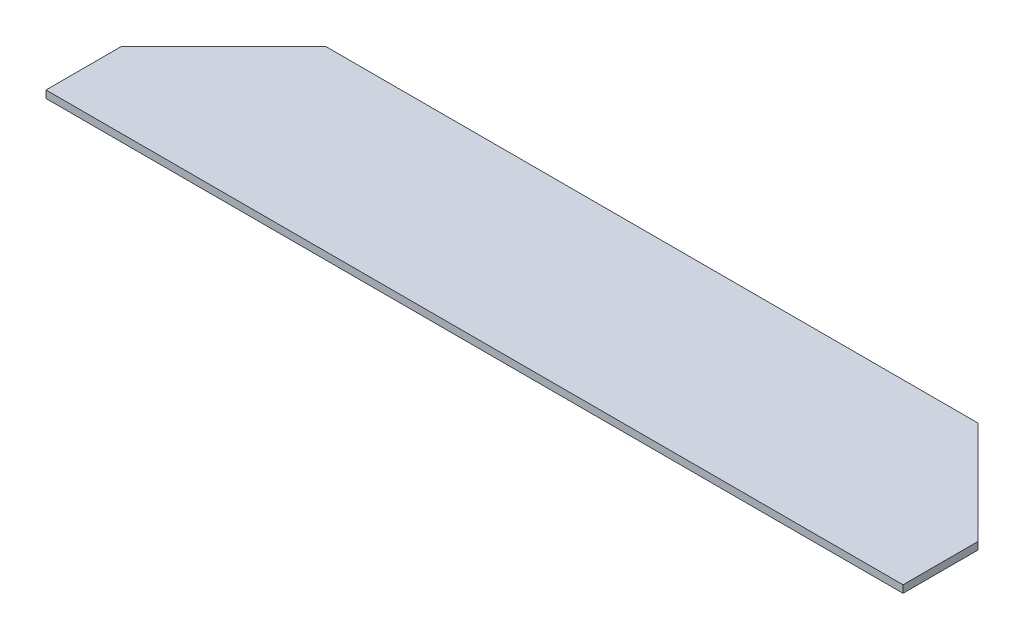
ISO-10303-21;
HEADER;
FILE_DESCRIPTION(('STEP AP214'),'2;1');
FILE_NAME('part.step','',(''),(''),'','','');
FILE_SCHEMA(('AUTOMOTIVE_DESIGN { 1 0 10303 214 1 1 1 1 }'));
ENDSEC;
DATA;
#1=APPLICATION_CONTEXT('core data for automotive mechanical design processes');
#2=APPLICATION_PROTOCOL_DEFINITION('international standard','automotive_design',2000,#1);
#3=PRODUCT_CONTEXT('',#1,'mechanical');
#4=PRODUCT('Part','Part','',(#3));
#5=PRODUCT_RELATED_PRODUCT_CATEGORY('part','',(#4));
#6=PRODUCT_DEFINITION_FORMATION('','',#4);
#7=PRODUCT_DEFINITION_CONTEXT('part definition',#1,'design');
#8=PRODUCT_DEFINITION('design','',#6,#7);
#9=PRODUCT_DEFINITION_SHAPE('','',#8);
#10=(LENGTH_UNIT() NAMED_UNIT(*) SI_UNIT(.MILLI.,.METRE.));
#11=(NAMED_UNIT(*) PLANE_ANGLE_UNIT() SI_UNIT($,.RADIAN.));
#12=(NAMED_UNIT(*) SI_UNIT($,.STERADIAN.) SOLID_ANGLE_UNIT());
#13=UNCERTAINTY_MEASURE_WITH_UNIT(LENGTH_MEASURE(1.E-05),#10,'distance_accuracy_value','');
#14=(GEOMETRIC_REPRESENTATION_CONTEXT(3) GLOBAL_UNCERTAINTY_ASSIGNED_CONTEXT((#13)) GLOBAL_UNIT_ASSIGNED_CONTEXT((#10,
#11,#12)) REPRESENTATION_CONTEXT('',''));
#15=CARTESIAN_POINT('',(0.,0.,0.));
#16=DIRECTION('',(0.,0.,1.));
#17=DIRECTION('',(1.,0.,0.));
#18=AXIS2_PLACEMENT_3D('',#15,#16,#17);
#19=CARTESIAN_POINT('',(-685.8,11.8872,-142.0622));
#20=DIRECTION('',(1.,0.,0.));
#21=DIRECTION('',(0.,0.,-1.));
#22=AXIS2_PLACEMENT_3D('',#19,#20,#21);
#23=PLANE('',#22);
#24=DIRECTION('',(0.,0.,1.));
#25=VECTOR('',#24,1.);
#26=CARTESIAN_POINT('',(-685.8,11.8872,-142.0622));
#27=LINE('',#26,#25);
#28=CARTESIAN_POINT('',(-685.8,11.8872,22.0622));
#29=VERTEX_POINT('',#28);
#30=CARTESIAN_POINT('',(-685.8,11.8872,142.0622));
#31=VERTEX_POINT('',#30);
#32=EDGE_CURVE('E107',#29,#31,#27,.T.);
#33=ORIENTED_EDGE('',*,*,#32,.F.);
#34=DIRECTION('',(0.,1.,0.));
#35=VECTOR('',#34,1.);
#36=CARTESIAN_POINT('',(-685.8,0.,22.0622));
#37=LINE('',#36,#35);
#38=CARTESIAN_POINT('',(-685.8,0.,22.0622));
#39=VERTEX_POINT('',#38);
#40=EDGE_CURVE('E93',#39,#29,#37,.T.);
#41=ORIENTED_EDGE('',*,*,#40,.F.);
#42=DIRECTION('',(0.,0.,1.));
#43=VECTOR('',#42,1.);
#44=CARTESIAN_POINT('',(-685.8,0.,-142.0622));
#45=LINE('',#44,#43);
#46=CARTESIAN_POINT('',(-685.8,0.,142.0622));
#47=VERTEX_POINT('',#46);
#48=EDGE_CURVE('E105',#39,#47,#45,.T.);
#49=ORIENTED_EDGE('',*,*,#48,.T.);
#50=DIRECTION('',(0.,-1.,0.));
#51=VECTOR('',#50,1.);
#52=CARTESIAN_POINT('',(-685.8,11.8872,142.0622));
#53=LINE('',#52,#51);
#54=EDGE_CURVE('E11',#31,#47,#53,.T.);
#55=ORIENTED_EDGE('',*,*,#54,.F.);
#56=EDGE_LOOP('',(#33,#41,#49,#55));
#57=FACE_BOUND('',#56,.T.);
#58=ADVANCED_FACE('F39',(#57),#23,.F.);
#59=CARTESIAN_POINT('',(685.8,11.8872,142.0622));
#60=DIRECTION('',(0.,0.,-1.));
#61=DIRECTION('',(-1.,0.,0.));
#62=AXIS2_PLACEMENT_3D('',#59,#60,#61);
#63=PLANE('',#62);
#64=DIRECTION('',(1.,0.,0.));
#65=VECTOR('',#64,1.);
#66=CARTESIAN_POINT('',(685.8,0.,142.0622));
#67=LINE('',#66,#65);
#68=CARTESIAN_POINT('',(685.8,0.,142.0622));
#69=VERTEX_POINT('',#68);
#70=EDGE_CURVE('E111',#47,#69,#67,.T.);
#71=ORIENTED_EDGE('',*,*,#70,.T.);
#72=DIRECTION('',(0.,-1.,0.));
#73=VECTOR('',#72,1.);
#74=CARTESIAN_POINT('',(685.8,11.8872,142.0622));
#75=LINE('',#74,#73);
#76=CARTESIAN_POINT('',(685.8,11.8872,142.0622));
#77=VERTEX_POINT('',#76);
#78=EDGE_CURVE('E46',#77,#69,#75,.T.);
#79=ORIENTED_EDGE('',*,*,#78,.F.);
#80=DIRECTION('',(1.,0.,0.));
#81=VECTOR('',#80,1.);
#82=CARTESIAN_POINT('',(685.8,11.8872,142.0622));
#83=LINE('',#82,#81);
#84=EDGE_CURVE('E137',#31,#77,#83,.T.);
#85=ORIENTED_EDGE('',*,*,#84,.F.);
#86=ORIENTED_EDGE('',*,*,#54,.T.);
#87=EDGE_LOOP('',(#71,#79,#85,#86));
#88=FACE_BOUND('',#87,.T.);
#89=ADVANCED_FACE('F157',(#88),#63,.F.);
#90=CARTESIAN_POINT('',(685.8,11.8872,-142.0622));
#91=DIRECTION('',(-1.,0.,0.));
#92=DIRECTION('',(0.,0.,1.));
#93=AXIS2_PLACEMENT_3D('',#90,#91,#92);
#94=PLANE('',#93);
#95=DIRECTION('',(0.,0.,-1.));
#96=VECTOR('',#95,1.);
#97=CARTESIAN_POINT('',(685.8,0.,-142.0622));
#98=LINE('',#97,#96);
#99=CARTESIAN_POINT('',(685.8,0.,22.0621999999998));
#100=VERTEX_POINT('',#99);
#101=EDGE_CURVE('E114',#69,#100,#98,.T.);
#102=ORIENTED_EDGE('',*,*,#101,.T.);
#103=DIRECTION('',(0.,1.,0.));
#104=VECTOR('',#103,1.);
#105=CARTESIAN_POINT('',(685.8,0.,22.0621999999998));
#106=LINE('',#105,#104);
#107=CARTESIAN_POINT('',(685.8,11.8872,22.0621999999998));
#108=VERTEX_POINT('',#107);
#109=EDGE_CURVE('E53',#100,#108,#106,.T.);
#110=ORIENTED_EDGE('',*,*,#109,.T.);
#111=DIRECTION('',(0.,0.,-1.));
#112=VECTOR('',#111,1.);
#113=CARTESIAN_POINT('',(685.8,11.8872,-142.0622));
#114=LINE('',#113,#112);
#115=EDGE_CURVE('E131',#77,#108,#114,.T.);
#116=ORIENTED_EDGE('',*,*,#115,.F.);
#117=ORIENTED_EDGE('',*,*,#78,.T.);
#118=EDGE_LOOP('',(#102,#110,#116,#117));
#119=FACE_BOUND('',#118,.T.);
#120=ADVANCED_FACE('F155',(#119),#94,.F.);
#121=CARTESIAN_POINT('',(685.8,11.8872,-142.0622));
#122=DIRECTION('',(0.,0.,1.));
#123=DIRECTION('',(1.,0.,0.));
#124=AXIS2_PLACEMENT_3D('',#121,#122,#123);
#125=PLANE('',#124);
#126=DIRECTION('',(-1.,0.,0.));
#127=VECTOR('',#126,1.);
#128=CARTESIAN_POINT('',(685.8,0.,-142.0622));
#129=LINE('',#128,#127);
#130=CARTESIAN_POINT('',(521.675600000002,0.,-142.0622));
#131=VERTEX_POINT('',#130);
#132=CARTESIAN_POINT('',(-521.675600000002,0.,-142.0622));
#133=VERTEX_POINT('',#132);
#134=EDGE_CURVE('E123',#131,#133,#129,.T.);
#135=ORIENTED_EDGE('',*,*,#134,.T.);
#136=DIRECTION('',(0.,1.,0.));
#137=VECTOR('',#136,1.);
#138=CARTESIAN_POINT('',(-521.675600000002,0.,-142.0622));
#139=LINE('',#138,#137);
#140=CARTESIAN_POINT('',(-521.675600000002,11.8872,-142.0622));
#141=VERTEX_POINT('',#140);
#142=EDGE_CURVE('E61',#133,#141,#139,.T.);
#143=ORIENTED_EDGE('',*,*,#142,.T.);
#144=DIRECTION('',(-1.,0.,0.));
#145=VECTOR('',#144,1.);
#146=CARTESIAN_POINT('',(685.8,11.8872,-142.0622));
#147=LINE('',#146,#145);
#148=CARTESIAN_POINT('',(521.675600000002,11.8872,-142.0622));
#149=VERTEX_POINT('',#148);
#150=EDGE_CURVE('E118',#149,#141,#147,.T.);
#151=ORIENTED_EDGE('',*,*,#150,.F.);
#152=DIRECTION('',(0.,1.,0.));
#153=VECTOR('',#152,1.);
#154=CARTESIAN_POINT('',(521.675600000002,0.,-142.0622));
#155=LINE('',#154,#153);
#156=EDGE_CURVE('E142',#131,#149,#155,.T.);
#157=ORIENTED_EDGE('',*,*,#156,.F.);
#158=EDGE_LOOP('',(#135,#143,#151,#157));
#159=FACE_BOUND('',#158,.T.);
#160=ADVANCED_FACE('F153',(#159),#125,.F.);
#161=CARTESIAN_POINT('',(0.,11.8872,0.));
#162=DIRECTION('',(0.,-1.,0.));
#163=DIRECTION('',(0.,0.,-1.));
#164=AXIS2_PLACEMENT_3D('',#161,#162,#163);
#165=PLANE('',#164);
#166=ORIENTED_EDGE('',*,*,#150,.T.);
#167=DIRECTION('',(0.707106781186544,0.,-0.707106781186551));
#168=VECTOR('',#167,1.);
#169=CARTESIAN_POINT('',(-685.8,11.8872,22.0622));
#170=LINE('',#169,#168);
#171=EDGE_CURVE('E100',#29,#141,#170,.T.);
#172=ORIENTED_EDGE('',*,*,#171,.F.);
#173=ORIENTED_EDGE('',*,*,#32,.T.);
#174=ORIENTED_EDGE('',*,*,#84,.T.);
#175=ORIENTED_EDGE('',*,*,#115,.T.);
#176=DIRECTION('',(0.707106781186544,0.,0.707106781186551));
#177=VECTOR('',#176,1.);
#178=CARTESIAN_POINT('',(685.8,11.8872,22.0621999999998));
#179=LINE('',#178,#177);
#180=EDGE_CURVE('E147',#149,#108,#179,.T.);
#181=ORIENTED_EDGE('',*,*,#180,.F.);
#182=EDGE_LOOP('',(#166,#172,#173,#174,#175,#181));
#183=FACE_BOUND('',#182,.T.);
#184=ADVANCED_FACE('F163',(#183),#165,.F.);
#185=CARTESIAN_POINT('',(0.,0.,0.));
#186=DIRECTION('',(0.,-1.,0.));
#187=DIRECTION('',(0.,0.,-1.));
#188=AXIS2_PLACEMENT_3D('',#185,#186,#187);
#189=PLANE('',#188);
#190=DIRECTION('',(0.707106781186544,0.,-0.707106781186551));
#191=VECTOR('',#190,1.);
#192=CARTESIAN_POINT('',(-685.8,0.,22.0622));
#193=LINE('',#192,#191);
#194=EDGE_CURVE('E90',#39,#133,#193,.T.);
#195=ORIENTED_EDGE('',*,*,#194,.T.);
#196=ORIENTED_EDGE('',*,*,#134,.F.);
#197=DIRECTION('',(0.707106781186544,0.,0.707106781186551));
#198=VECTOR('',#197,1.);
#199=CARTESIAN_POINT('',(685.8,0.,22.0621999999998));
#200=LINE('',#199,#198);
#201=EDGE_CURVE('E145',#131,#100,#200,.T.);
#202=ORIENTED_EDGE('',*,*,#201,.T.);
#203=ORIENTED_EDGE('',*,*,#101,.F.);
#204=ORIENTED_EDGE('',*,*,#70,.F.);
#205=ORIENTED_EDGE('',*,*,#48,.F.);
#206=EDGE_LOOP('',(#195,#196,#202,#203,#204,#205));
#207=FACE_BOUND('',#206,.T.);
#208=ADVANCED_FACE('F109',(#207),#189,.T.);
#209=CARTESIAN_POINT('',(685.8,0.,22.0621999999998));
#210=DIRECTION('',(-0.707106781186551,0.,0.707106781186544));
#211=DIRECTION('',(0.707106781186544,0.,0.707106781186551));
#212=AXIS2_PLACEMENT_3D('',#209,#210,#211);
#213=PLANE('',#212);
#214=ORIENTED_EDGE('',*,*,#180,.T.);
#215=ORIENTED_EDGE('',*,*,#109,.F.);
#216=ORIENTED_EDGE('',*,*,#201,.F.);
#217=ORIENTED_EDGE('',*,*,#156,.T.);
#218=EDGE_LOOP('',(#214,#215,#216,#217));
#219=FACE_BOUND('',#218,.T.);
#220=ADVANCED_FACE('F203',(#219),#213,.F.);
#221=CARTESIAN_POINT('',(-685.8,0.,22.0622));
#222=DIRECTION('',(0.707106781186551,0.,0.707106781186544));
#223=DIRECTION('',(0.707106781186544,0.,-0.707106781186551));
#224=AXIS2_PLACEMENT_3D('',#221,#222,#223);
#225=PLANE('',#224);
#226=ORIENTED_EDGE('',*,*,#171,.T.);
#227=ORIENTED_EDGE('',*,*,#142,.F.);
#228=ORIENTED_EDGE('',*,*,#194,.F.);
#229=ORIENTED_EDGE('',*,*,#40,.T.);
#230=EDGE_LOOP('',(#226,#227,#228,#229));
#231=FACE_BOUND('',#230,.T.);
#232=ADVANCED_FACE('F92',(#231),#225,.F.);
#233=CLOSED_SHELL('',(#58,#89,#120,#160,#184,#208,#220,#232));
#234=MANIFOLD_SOLID_BREP('B2',#233);
#235=ADVANCED_BREP_SHAPE_REPRESENTATION('',(#18,#234),#14);
#236=SHAPE_DEFINITION_REPRESENTATION(#9,#235);
ENDSEC;
END-ISO-10303-21;
